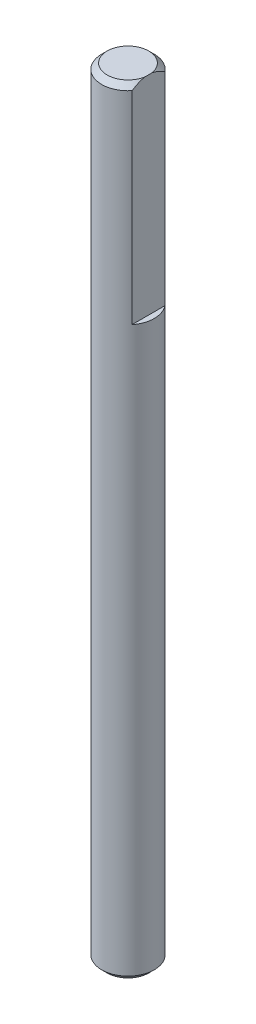
ISO-10303-21;
HEADER;
FILE_DESCRIPTION(('STEP AP214'),'2;1');
FILE_NAME('part.step','',(''),(''),'','','');
FILE_SCHEMA(('AUTOMOTIVE_DESIGN { 1 0 10303 214 1 1 1 1 }'));
ENDSEC;
DATA;
#1=APPLICATION_CONTEXT('core data for automotive mechanical design processes');
#2=APPLICATION_PROTOCOL_DEFINITION('international standard','automotive_design',2000,#1);
#3=PRODUCT_CONTEXT('',#1,'mechanical');
#4=PRODUCT('Part','Part','',(#3));
#5=PRODUCT_RELATED_PRODUCT_CATEGORY('part','',(#4));
#6=PRODUCT_DEFINITION_FORMATION('','',#4);
#7=PRODUCT_DEFINITION_CONTEXT('part definition',#1,'design');
#8=PRODUCT_DEFINITION('design','',#6,#7);
#9=PRODUCT_DEFINITION_SHAPE('','',#8);
#10=(LENGTH_UNIT() NAMED_UNIT(*) SI_UNIT(.MILLI.,.METRE.));
#11=(NAMED_UNIT(*) PLANE_ANGLE_UNIT() SI_UNIT($,.RADIAN.));
#12=(NAMED_UNIT(*) SI_UNIT($,.STERADIAN.) SOLID_ANGLE_UNIT());
#13=UNCERTAINTY_MEASURE_WITH_UNIT(LENGTH_MEASURE(1.E-05),#10,'distance_accuracy_value','');
#14=(GEOMETRIC_REPRESENTATION_CONTEXT(3) GLOBAL_UNCERTAINTY_ASSIGNED_CONTEXT((#13)) GLOBAL_UNIT_ASSIGNED_CONTEXT((#10,
#11,#12)) REPRESENTATION_CONTEXT('',''));
#15=CARTESIAN_POINT('',(0.,0.,0.));
#16=DIRECTION('',(0.,0.,1.));
#17=DIRECTION('',(1.,0.,0.));
#18=AXIS2_PLACEMENT_3D('',#15,#16,#17);
#19=CARTESIAN_POINT('',(0.,71.,0.));
#20=DIRECTION('',(0.,-1.,0.));
#21=DIRECTION('',(0.,0.,-1.));
#22=AXIS2_PLACEMENT_3D('',#19,#20,#21);
#23=CYLINDRICAL_SURFACE('',#22,2.4);
#24=CARTESIAN_POINT('',(0.,0.499999999999987,0.));
#25=DIRECTION('',(0.,1.,0.));
#26=DIRECTION('',(0.,0.,1.));
#27=AXIS2_PLACEMENT_3D('',#24,#25,#26);
#28=CIRCLE('',#27,2.4);
#29=CARTESIAN_POINT('',(0.,0.499999999999987,2.4));
#30=VERTEX_POINT('',#29);
#31=EDGE_CURVE('E120',#30,#30,#28,.T.);
#32=ORIENTED_EDGE('',*,*,#31,.T.);
#33=EDGE_LOOP('',(#32));
#34=FACE_BOUND('',#33,.T.);
#35=DIRECTION('',(0.,1.,0.));
#36=VECTOR('',#35,1.);
#37=CARTESIAN_POINT('',(1.87349939951953,52.,1.5));
#38=LINE('',#37,#36);
#39=CARTESIAN_POINT('',(1.87349939951953,52.,1.5));
#40=VERTEX_POINT('',#39);
#41=CARTESIAN_POINT('',(1.87349939951953,70.5,1.5));
#42=VERTEX_POINT('',#41);
#43=EDGE_CURVE('E102',#40,#42,#38,.T.);
#44=ORIENTED_EDGE('',*,*,#43,.T.);
#45=CARTESIAN_POINT('',(0.,70.5,0.));
#46=DIRECTION('',(0.,1.,0.));
#47=DIRECTION('',(0.,0.,1.));
#48=AXIS2_PLACEMENT_3D('',#45,#46,#47);
#49=CIRCLE('',#48,2.4);
#50=CARTESIAN_POINT('',(1.87349939951952,70.5,-1.50000000000001));
#51=VERTEX_POINT('',#50);
#52=EDGE_CURVE('E110',#42,#51,#49,.F.);
#53=ORIENTED_EDGE('',*,*,#52,.T.);
#54=DIRECTION('',(0.,1.,0.));
#55=VECTOR('',#54,1.);
#56=CARTESIAN_POINT('',(1.87349939951952,52.,-1.50000000000001));
#57=LINE('',#56,#55);
#58=CARTESIAN_POINT('',(1.87349939951952,52.,-1.50000000000001));
#59=VERTEX_POINT('',#58);
#60=EDGE_CURVE('E103',#59,#51,#57,.T.);
#61=ORIENTED_EDGE('',*,*,#60,.F.);
#62=CARTESIAN_POINT('',(0.,52.,0.));
#63=DIRECTION('',(0.,1.,0.));
#64=DIRECTION('',(0.,0.,1.));
#65=AXIS2_PLACEMENT_3D('',#62,#63,#64);
#66=CIRCLE('',#65,2.4);
#67=EDGE_CURVE('E95',#40,#59,#66,.T.);
#68=ORIENTED_EDGE('',*,*,#67,.F.);
#69=EDGE_LOOP('',(#44,#53,#61,#68));
#70=FACE_BOUND('',#69,.T.);
#71=ADVANCED_FACE('F47',(#34,#70),#23,.T.);
#72=CARTESIAN_POINT('',(0.,71.,0.));
#73=DIRECTION('',(0.,1.,0.));
#74=DIRECTION('',(0.,0.,1.));
#75=AXIS2_PLACEMENT_3D('',#72,#73,#74);
#76=PLANE('',#75);
#77=DIRECTION('',(0.,0.,1.));
#78=VECTOR('',#77,1.);
#79=CARTESIAN_POINT('',(1.87349939951952,71.,-1.50000000000001));
#80=LINE('',#79,#78);
#81=CARTESIAN_POINT('',(1.87349939951952,71.,-0.316227766016792));
#82=VERTEX_POINT('',#81);
#83=CARTESIAN_POINT('',(1.87349939951952,71.,0.316227766016789));
#84=VERTEX_POINT('',#83);
#85=EDGE_CURVE('E99',#82,#84,#80,.T.);
#86=ORIENTED_EDGE('',*,*,#85,.F.);
#87=CARTESIAN_POINT('',(0.,71.,0.));
#88=DIRECTION('',(0.,1.,0.));
#89=DIRECTION('',(0.,0.,1.));
#90=AXIS2_PLACEMENT_3D('',#87,#88,#89);
#91=CIRCLE('',#90,1.89999999999999);
#92=EDGE_CURVE('E123',#82,#84,#91,.T.);
#93=ORIENTED_EDGE('',*,*,#92,.T.);
#94=EDGE_LOOP('',(#86,#93));
#95=FACE_BOUND('',#94,.T.);
#96=ADVANCED_FACE('F139',(#95),#76,.T.);
#97=CARTESIAN_POINT('',(0.,0.,0.));
#98=DIRECTION('',(0.,1.,0.));
#99=DIRECTION('',(0.,0.,1.));
#100=AXIS2_PLACEMENT_3D('',#97,#98,#99);
#101=PLANE('',#100);
#102=CARTESIAN_POINT('',(0.,0.,0.));
#103=DIRECTION('',(0.,1.,0.));
#104=DIRECTION('',(0.,0.,1.));
#105=AXIS2_PLACEMENT_3D('',#102,#103,#104);
#106=CIRCLE('',#105,1.90000000000001);
#107=CARTESIAN_POINT('',(0.,0.,1.90000000000001));
#108=VERTEX_POINT('',#107);
#109=EDGE_CURVE('E122',#108,#108,#106,.F.);
#110=ORIENTED_EDGE('',*,*,#109,.T.);
#111=EDGE_LOOP('',(#110));
#112=FACE_BOUND('',#111,.T.);
#113=ADVANCED_FACE('F137',(#112),#101,.F.);
#114=CARTESIAN_POINT('',(1.87349939951952,52.,-1.50000000000001));
#115=DIRECTION('',(-1.,0.,0.));
#116=DIRECTION('',(0.,0.,1.));
#117=AXIS2_PLACEMENT_3D('',#114,#115,#116);
#118=PLANE('',#117);
#119=ORIENTED_EDGE('',*,*,#85,.T.);
#120=CARTESIAN_POINT('',(1.87349939951952,71.,0.316227766016789));
#121=CARTESIAN_POINT('',(1.87349939951952,70.9885908948235,0.384927023889514));
#122=CARTESIAN_POINT('',(1.87349939951952,70.9736221711596,0.45293311185894));
#123=CARTESIAN_POINT('',(1.87349939951952,70.9376996148176,0.587171884912513));
#124=CARTESIAN_POINT('',(1.87349939951952,70.9167614321579,0.653408718206418));
#125=CARTESIAN_POINT('',(1.87349939951952,70.8702060247764,0.78340383402743));
#126=CARTESIAN_POINT('',(1.87349939951952,70.8446395495089,0.847180691069969));
#127=CARTESIAN_POINT('',(1.87349939951952,70.7896296045526,0.973070246742383));
#128=CARTESIAN_POINT('',(1.87349939951952,70.7601838157452,1.03518192295541));
#129=CARTESIAN_POINT('',(1.87349939951953,70.6944323782261,1.16536480508412));
#130=CARTESIAN_POINT('',(1.87349939951952,70.6577283206119,1.23323261910599));
#131=CARTESIAN_POINT('',(1.87349939951952,70.5810642087084,1.36765436203002));
#132=CARTESIAN_POINT('',(1.87349939951952,70.541085853863,1.43419789934169));
#133=CARTESIAN_POINT('',(1.87349939951953,70.5,1.5));
#134=B_SPLINE_CURVE_WITH_KNOTS('',3,(#120,#121,#122,#123,#124,#125,#126,#127,#128,#129,#130,
#131,#132,#133),.UNSPECIFIED.,.F.,.F.,(4,2,2,2,2,2,4),(0.,0.208681924055489,0.416821703754691,
0.622804044340832,0.828910088182312,1.06029461324087,1.29307450942948),.UNSPECIFIED.);
#135=EDGE_CURVE('E11',#84,#42,#134,.T.);
#136=ORIENTED_EDGE('',*,*,#135,.T.);
#137=ORIENTED_EDGE('',*,*,#43,.F.);
#138=DIRECTION('',(0.,0.,1.));
#139=VECTOR('',#138,1.);
#140=CARTESIAN_POINT('',(1.87349939951952,52.,-1.50000000000001));
#141=LINE('',#140,#139);
#142=EDGE_CURVE('E92',#59,#40,#141,.T.);
#143=ORIENTED_EDGE('',*,*,#142,.F.);
#144=ORIENTED_EDGE('',*,*,#60,.T.);
#145=CARTESIAN_POINT('',(1.87349939951952,70.5,-1.50000000000001));
#146=CARTESIAN_POINT('',(1.87349939951952,70.528619138771,-1.45419472304964));
#147=CARTESIAN_POINT('',(1.87349939951952,70.5566798502776,-1.40803282362396));
#148=CARTESIAN_POINT('',(1.87349939951952,70.6114426710405,-1.3148863800773));
#149=CARTESIAN_POINT('',(1.87349939951952,70.6381442251422,-1.26790151017612));
#150=CARTESIAN_POINT('',(1.87349939951952,70.6896788697934,-1.17348466784049));
#151=CARTESIAN_POINT('',(1.87349939951952,70.714527225022,-1.12606110877165));
#152=CARTESIAN_POINT('',(1.87349939951952,70.7623079527765,-1.03026773452283));
#153=CARTESIAN_POINT('',(1.87349939951952,70.785240303743,-0.98189790870275));
#154=CARTESIAN_POINT('',(1.87349939951952,70.8507928288871,-0.834848031952919));
#155=CARTESIAN_POINT('',(1.87349939951952,70.8899879889176,-0.734548068445421));
#156=CARTESIAN_POINT('',(1.87349939951952,70.9557310759218,-0.528914771041903));
#157=CARTESIAN_POINT('',(1.87349939951952,70.9821555122486,-0.423542717864718));
#158=CARTESIAN_POINT('',(1.87349939951952,71.,-0.316227766016813));
#159=B_SPLINE_CURVE_WITH_KNOTS('',3,(#145,#146,#147,#148,#149,#150,#151,#152,#153,#154,#155,
#156,#157,#158),.UNSPECIFIED.,.F.,.F.,(4,2,2,2,2,2,4),(0.,0.162037621929279,0.324140906402589,
0.484713240166836,0.645287380492313,0.967536192444064,1.29284166529001),.UNSPECIFIED.);
#160=EDGE_CURVE('E64',#51,#82,#159,.T.);
#161=ORIENTED_EDGE('',*,*,#160,.T.);
#162=EDGE_LOOP('',(#119,#136,#137,#143,#144,#161));
#163=FACE_BOUND('',#162,.T.);
#164=ADVANCED_FACE('F105',(#163),#118,.F.);
#165=CARTESIAN_POINT('',(0.,52.,0.));
#166=DIRECTION('',(0.,1.,0.));
#167=DIRECTION('',(0.,0.,1.));
#168=AXIS2_PLACEMENT_3D('',#165,#166,#167);
#169=PLANE('',#168);
#170=ORIENTED_EDGE('',*,*,#67,.T.);
#171=ORIENTED_EDGE('',*,*,#142,.T.);
#172=EDGE_LOOP('',(#170,#171));
#173=FACE_BOUND('',#172,.T.);
#174=ADVANCED_FACE('F94',(#173),#169,.T.);
#175=CARTESIAN_POINT('',(0.,0.499999999999987,0.));
#176=DIRECTION('',(0.,1.,0.));
#177=DIRECTION('',(0.,0.,1.));
#178=AXIS2_PLACEMENT_3D('',#175,#176,#177);
#179=CONICAL_SURFACE('',#178,2.4,0.785398163397456);
#180=ORIENTED_EDGE('',*,*,#109,.F.);
#181=EDGE_LOOP('',(#180));
#182=FACE_BOUND('',#181,.T.);
#183=ORIENTED_EDGE('',*,*,#31,.F.);
#184=EDGE_LOOP('',(#183));
#185=FACE_BOUND('',#184,.T.);
#186=ADVANCED_FACE('F146',(#182,#185),#179,.T.);
#187=CARTESIAN_POINT('',(0.,71.,0.));
#188=DIRECTION('',(0.,-1.,0.));
#189=DIRECTION('',(0.,0.,-1.));
#190=AXIS2_PLACEMENT_3D('',#187,#188,#189);
#191=CONICAL_SURFACE('',#190,1.89999999999999,0.785398163397442);
#192=ORIENTED_EDGE('',*,*,#160,.F.);
#193=ORIENTED_EDGE('',*,*,#52,.F.);
#194=ORIENTED_EDGE('',*,*,#135,.F.);
#195=ORIENTED_EDGE('',*,*,#92,.F.);
#196=EDGE_LOOP('',(#192,#193,#194,#195));
#197=FACE_BOUND('',#196,.T.);
#198=ADVANCED_FACE('F55',(#197),#191,.T.);
#199=CLOSED_SHELL('',(#71,#96,#113,#164,#174,#186,#198));
#200=MANIFOLD_SOLID_BREP('B2',#199);
#201=ADVANCED_BREP_SHAPE_REPRESENTATION('',(#18,#200),#14);
#202=SHAPE_DEFINITION_REPRESENTATION(#9,#201);
ENDSEC;
END-ISO-10303-21;
